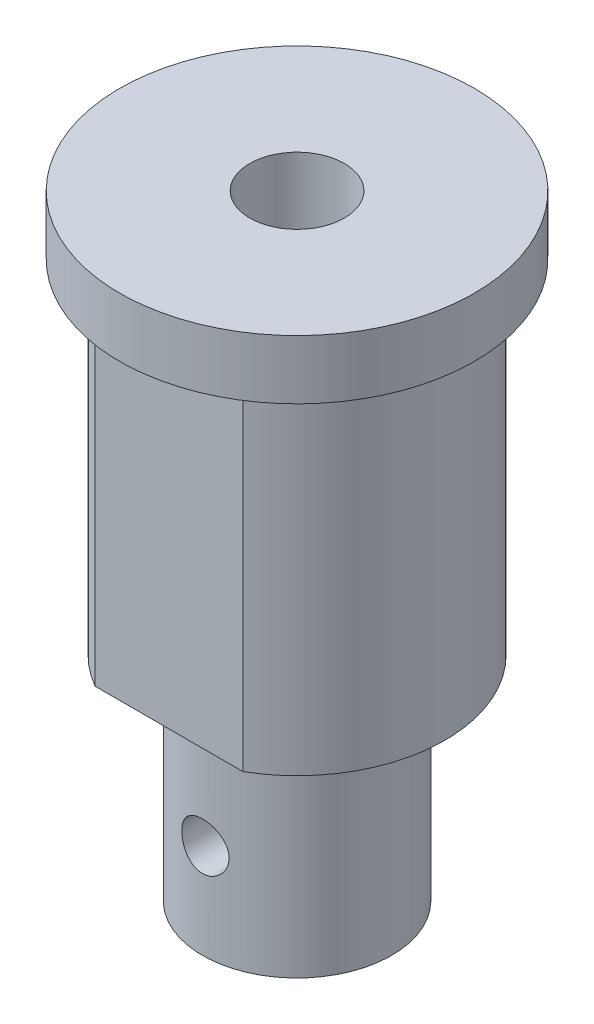
ISO-10303-21;
HEADER;
FILE_DESCRIPTION(('STEP AP214'),'2;1');
FILE_NAME('part.step','',(''),(''),'','','');
FILE_SCHEMA(('AUTOMOTIVE_DESIGN { 1 0 10303 214 1 1 1 1 }'));
ENDSEC;
DATA;
#1=APPLICATION_CONTEXT('core data for automotive mechanical design processes');
#2=APPLICATION_PROTOCOL_DEFINITION('international standard','automotive_design',2000,#1);
#3=PRODUCT_CONTEXT('',#1,'mechanical');
#4=PRODUCT('Part','Part','',(#3));
#5=PRODUCT_RELATED_PRODUCT_CATEGORY('part','',(#4));
#6=PRODUCT_DEFINITION_FORMATION('','',#4);
#7=PRODUCT_DEFINITION_CONTEXT('part definition',#1,'design');
#8=PRODUCT_DEFINITION('design','',#6,#7);
#9=PRODUCT_DEFINITION_SHAPE('','',#8);
#10=(LENGTH_UNIT() NAMED_UNIT(*) SI_UNIT(.MILLI.,.METRE.));
#11=(NAMED_UNIT(*) PLANE_ANGLE_UNIT() SI_UNIT($,.RADIAN.));
#12=(NAMED_UNIT(*) SI_UNIT($,.STERADIAN.) SOLID_ANGLE_UNIT());
#13=UNCERTAINTY_MEASURE_WITH_UNIT(LENGTH_MEASURE(1.E-05),#10,'distance_accuracy_value','');
#14=(GEOMETRIC_REPRESENTATION_CONTEXT(3) GLOBAL_UNCERTAINTY_ASSIGNED_CONTEXT((#13)) GLOBAL_UNIT_ASSIGNED_CONTEXT((#10,
#11,#12)) REPRESENTATION_CONTEXT('',''));
#15=CARTESIAN_POINT('',(0.,0.,0.));
#16=DIRECTION('',(0.,0.,1.));
#17=DIRECTION('',(1.,0.,0.));
#18=AXIS2_PLACEMENT_3D('',#15,#16,#17);
#19=CARTESIAN_POINT('',(0.,0.,0.));
#20=DIRECTION('',(0.,-1.,0.));
#21=DIRECTION('',(0.,0.,-1.));
#22=AXIS2_PLACEMENT_3D('',#19,#20,#21);
#23=CYLINDRICAL_SURFACE('',#22,4.);
#24=CARTESIAN_POINT('',(-2.,10.,3.46410161513775));
#25=CARTESIAN_POINT('',(-1.99999158748781,10.1042132054743,3.46411185715888));
#26=CARTESIAN_POINT('',(-1.99179963610437,10.2085621765338,3.46887633544978));
#27=CARTESIAN_POINT('',(-1.95944672580053,10.4140551772306,3.48724701669072));
#28=CARTESIAN_POINT('',(-1.93525221095662,10.5151920032478,3.50087179788183));
#29=CARTESIAN_POINT('',(-1.8721998159803,10.7109031564469,3.53498701490001));
#30=CARTESIAN_POINT('',(-1.83341988295963,10.8055092588493,3.55544089069169));
#31=CARTESIAN_POINT('',(-1.74253507245138,10.9868484504762,3.60085327291133));
#32=CARTESIAN_POINT('',(-1.69042947410139,11.0735811134368,3.62581202301253));
#33=CARTESIAN_POINT('',(-1.569333074538,11.2446114431334,3.67993738819289));
#34=CARTESIAN_POINT('',(-1.49930407053533,11.3281182675918,3.70928127465103));
#35=CARTESIAN_POINT('',(-1.34650761698202,11.4828167805706,3.76743965382121));
#36=CARTESIAN_POINT('',(-1.26373385204841,11.554002326204,3.79625387610258));
#37=CARTESIAN_POINT('',(-1.08097912631265,11.6867343011885,3.85242953961661));
#38=CARTESIAN_POINT('',(-0.980214377887152,11.7473075354233,3.87956212851245));
#39=CARTESIAN_POINT('',(-0.768314053336917,11.8502817067871,3.92701512184167));
#40=CARTESIAN_POINT('',(-0.657185076311986,11.8926941123508,3.94733982363631));
#41=CARTESIAN_POINT('',(-0.436089887818818,11.9550093225312,3.97760922492053));
#42=CARTESIAN_POINT('',(-0.326603580968786,11.9762990526921,3.98818960442739));
#43=CARTESIAN_POINT('',(-0.105141257404541,12.000332237369,4.00015167691179));
#44=CARTESIAN_POINT('',(0.00683321168520633,12.0030869135963,4.00153893568935));
#45=CARTESIAN_POINT('',(0.219665048849571,11.9905066520549,3.99525963833124));
#46=CARTESIAN_POINT('',(0.320642398354137,11.9767239689564,3.98836991784381));
#47=CARTESIAN_POINT('',(0.518627543836087,11.9342383121919,3.96748490519435));
#48=CARTESIAN_POINT('',(0.6156350421877,11.9055342220479,3.95348908132771));
#49=CARTESIAN_POINT('',(0.804618783139258,11.83383486782,3.91943166575325));
#50=CARTESIAN_POINT('',(0.896506847030396,11.7906473736558,3.89928883058403));
#51=CARTESIAN_POINT('',(1.07195360302661,11.6914731675971,3.8547529197337));
#52=CARTESIAN_POINT('',(1.15550929767728,11.6354818733953,3.83035832314967));
#53=CARTESIAN_POINT('',(1.3203473217964,11.5062092969339,3.7768878879846));
#54=CARTESIAN_POINT('',(1.40066815005872,11.431793943348,3.74758751996351));
#55=CARTESIAN_POINT('',(1.54820874059556,11.2708205501397,3.68908681173623));
#56=CARTESIAN_POINT('',(1.61541842314846,11.1842532554519,3.65988656531258));
#57=CARTESIAN_POINT('',(1.73901066928442,10.9947036151518,3.60288312184969));
#58=CARTESIAN_POINT('',(1.7944346299561,10.8910279538916,3.57528639981415));
#59=CARTESIAN_POINT('',(1.88663822600246,10.674124657282,3.52750900557152));
#60=CARTESIAN_POINT('',(1.92343731642178,10.5609071339649,3.50732060092135));
#61=CARTESIAN_POINT('',(1.97436042205008,10.3375709774344,3.47889271634069));
#62=CARTESIAN_POINT('',(1.99005024423995,10.2279177619129,3.46983311696993));
#63=CARTESIAN_POINT('',(2.00303389322285,10.0071973169669,3.46235838723219));
#64=CARTESIAN_POINT('',(2.00034071463005,9.8961311417604,3.46393573778623));
#65=CARTESIAN_POINT('',(1.97807208668793,9.68869216284256,3.4766867308117));
#66=CARTESIAN_POINT('',(1.96037563342492,9.59204109778422,3.48679175013308));
#67=CARTESIAN_POINT('',(1.91139256926489,9.40326442745802,3.51388043102682));
#68=CARTESIAN_POINT('',(1.88010155724727,9.31114029850652,3.53086632010068));
#69=CARTESIAN_POINT('',(1.80329517720973,9.12917733819489,3.57072444159313));
#70=CARTESIAN_POINT('',(1.7571881273853,9.03964196629395,3.59383286486126));
#71=CARTESIAN_POINT('',(1.65257412803176,8.86906145692096,3.643122389945));
#72=CARTESIAN_POINT('',(1.59406080866499,8.78802071296949,3.66930506710298));
#73=CARTESIAN_POINT('',(1.45767433439709,8.62604246495734,3.72575996912669));
#74=CARTESIAN_POINT('',(1.37829054462748,8.54640569858222,3.75613166308566));
#75=CARTESIAN_POINT('',(1.20680899079904,8.40117552399527,3.81468469955797));
#76=CARTESIAN_POINT('',(1.11470694931991,8.33558685947316,3.84286530015463));
#77=CARTESIAN_POINT('',(0.91707072510806,8.21885254816729,3.89482723381867));
#78=CARTESIAN_POINT('',(0.811246195112496,8.16813376383323,3.91847283343884));
#79=CARTESIAN_POINT('',(0.591044729317866,8.08572419203039,3.95766709918776));
#80=CARTESIAN_POINT('',(0.476675402917654,8.0540166963159,3.97322287353397));
#81=CARTESIAN_POINT('',(0.253959364539765,8.01326287251486,3.99335016363174));
#82=CARTESIAN_POINT('',(0.146022887268302,8.00240425133572,3.9987985581427));
#83=CARTESIAN_POINT('',(-0.0702519714699439,7.99831346600433,4.00084260752374));
#84=CARTESIAN_POINT('',(-0.178590198981612,8.00507513147113,3.99744136141634));
#85=CARTESIAN_POINT('',(-0.385075986136858,8.0348328243164,3.98267937668509));
#86=CARTESIAN_POINT('',(-0.483424641057418,8.05672973730905,3.97185789309443));
#87=CARTESIAN_POINT('',(-0.674891898931564,8.11465395980667,3.94384187353387));
#88=CARTESIAN_POINT('',(-0.768009749669771,8.15068329570691,3.92664642364424));
#89=CARTESIAN_POINT('',(-0.95084683359674,8.2374542549914,3.8865186139318));
#90=CARTESIAN_POINT('',(-1.0402503657229,8.28875921975186,3.86337234005404));
#91=CARTESIAN_POINT('',(-1.20954920326828,8.40391528811809,3.81376266676027));
#92=CARTESIAN_POINT('',(-1.28944011444319,8.46777215410157,3.78729774583428));
#93=CARTESIAN_POINT('',(-1.44582833859495,8.61359663555941,3.73057218840582));
#94=CARTESIAN_POINT('',(-1.52119665879199,8.69673418080028,3.70019591726075));
#95=CARTESIAN_POINT('',(-1.65732528394006,8.87489222830609,3.64126158628571));
#96=CARTESIAN_POINT('',(-1.71807266521244,8.96992313136051,3.61270515130784));
#97=CARTESIAN_POINT('',(-1.82486714716811,9.17330889413024,3.55999186256751));
#98=CARTESIAN_POINT('',(-1.87038902381914,9.28198991073527,3.53600256268535));
#99=CARTESIAN_POINT('',(-1.92395929504801,9.45057811963094,3.5069621813237));
#100=CARTESIAN_POINT('',(-1.93935666147967,9.50764782059067,3.49844389329401));
#101=CARTESIAN_POINT('',(-1.96508069805043,9.62323255750019,3.48406059323535));
#102=CARTESIAN_POINT('',(-1.97541091343282,9.68174655275425,3.47819372636051));
#103=CARTESIAN_POINT('',(-1.9887293296122,9.78360078924729,3.47059023668758));
#104=CARTESIAN_POINT('',(-1.99295091983786,9.82673305725007,3.46816389731815));
#105=CARTESIAN_POINT('',(-1.99858810035606,9.9132356930929,3.46491740045177));
#106=CARTESIAN_POINT('',(-2.00000350293331,9.9566060766667,3.46409735040492));
#107=CARTESIAN_POINT('',(-2.,10.,3.46410161513775));
#108=B_SPLINE_CURVE_WITH_KNOTS('',3,(#24,#25,#26,#27,#28,#29,#30,#31,#32,#33,#34,#35,#36,#37,
#38,#39,#40,#41,#42,#43,#44,#45,#46,#47,#48,#49,#50,#51,#52,#53,#54,#55,#56,#57,#58,#59,#60,#61,
#62,#63,#64,#65,#66,#67,#68,#69,#70,#71,#72,#73,#74,#75,#76,#77,#78,#79,#80,#81,#82,#83,#84,#85,
#86,#87,#88,#89,#90,#91,#92,#93,#94,#95,#96,#97,#98,#99,#100,#101,#102,#103,#104,#105,#106,
#107),.UNSPECIFIED.,.T.,.F.,(4,2,2,2,2,2,2,2,2,2,2,2,2,2,2,2,2,2,2,2,2,2,2,2,2,2,2,2,2,2,2,2,2,
2,2,2,2,2,2,2,2,4),(0.,0.312464245189432,0.62558578564961,0.937057191861536,1.24854545093096,
1.58572462503714,1.92307142172809,2.28315784481594,2.64301653931849,2.97726969939937,
3.31132047376147,3.61632194973143,3.92134625038977,4.2305906946636,4.5399459870461,
4.87854382917848,5.21740096495904,5.57777683462963,5.93777548427476,6.2692458171249,
6.60048186380813,6.89548366852117,7.19058104876193,7.49934592816242,7.80826972444161,
8.15613487165293,8.50411729960471,8.86128362829998,9.2181355962161,9.5422454078304,
9.8662417359201,10.1688884974705,10.4715786702809,10.7872150144301,11.102996602055,
11.450204837042,11.7977188569438,12.1562149808128,12.3351395323571,12.5139387197526,
12.6440387634036,12.7741475095882),.UNSPECIFIED.);
#109=CARTESIAN_POINT('',(-2.,10.,3.46410161513775));
#110=VERTEX_POINT('',#109);
#111=EDGE_CURVE('E77',#110,#110,#108,.T.);
#112=ORIENTED_EDGE('',*,*,#111,.F.);
#113=EDGE_LOOP('',(#112));
#114=FACE_BOUND('',#113,.T.);
#115=CARTESIAN_POINT('',(0.,54.,0.));
#116=DIRECTION('',(0.,-1.,0.));
#117=DIRECTION('',(0.,0.,-1.));
#118=AXIS2_PLACEMENT_3D('',#115,#116,#117);
#119=CIRCLE('',#118,4.);
#120=CARTESIAN_POINT('',(0.,54.,-4.));
#121=VERTEX_POINT('',#120);
#122=EDGE_CURVE('E11',#121,#121,#119,.T.);
#123=ORIENTED_EDGE('',*,*,#122,.F.);
#124=EDGE_LOOP('',(#123));
#125=FACE_BOUND('',#124,.T.);
#126=CARTESIAN_POINT('',(0.,2.,0.));
#127=DIRECTION('',(0.,-1.,0.));
#128=DIRECTION('',(0.,0.,-1.));
#129=AXIS2_PLACEMENT_3D('',#126,#127,#128);
#130=CIRCLE('',#129,4.);
#131=CARTESIAN_POINT('',(0.,2.,-4.));
#132=VERTEX_POINT('',#131);
#133=EDGE_CURVE('E126',#132,#132,#130,.T.);
#134=ORIENTED_EDGE('',*,*,#133,.T.);
#135=EDGE_LOOP('',(#134));
#136=FACE_BOUND('',#135,.T.);
#137=ADVANCED_FACE('F47',(#114,#125,#136),#23,.F.);
#138=CARTESIAN_POINT('',(0.,0.,0.));
#139=DIRECTION('',(0.,-1.,0.));
#140=DIRECTION('',(0.,0.,-1.));
#141=AXIS2_PLACEMENT_3D('',#138,#139,#140);
#142=CYLINDRICAL_SURFACE('',#141,8.);
#143=CARTESIAN_POINT('',(-2.,10.,7.74596669241484));
#144=CARTESIAN_POINT('',(-1.99999686287446,9.88955939925874,7.74596880070288));
#145=CARTESIAN_POINT('',(-1.99082099639812,9.77908408105718,7.74835444811678));
#146=CARTESIAN_POINT('',(-1.95441850037103,9.56130593746119,7.75761489594052));
#147=CARTESIAN_POINT('',(-1.92718136539368,9.45400499642545,7.76449230897304));
#148=CARTESIAN_POINT('',(-1.85559295970563,9.24575716945025,7.7819097967692));
#149=CARTESIAN_POINT('',(-1.81126378228359,9.14480227569143,7.79244514152366));
#150=CARTESIAN_POINT('',(-1.70681691300911,8.95175131796809,7.81598553623007));
#151=CARTESIAN_POINT('',(-1.64669855084855,8.85965563033583,7.82899069102792));
#152=CARTESIAN_POINT('',(-1.51096674184951,8.68491068379023,7.856325730845));
#153=CARTESIAN_POINT('',(-1.43506951016324,8.60248511971996,7.87067678098428));
#154=CARTESIAN_POINT('',(-1.27054565128053,8.45139088451173,7.89890300412235));
#155=CARTESIAN_POINT('',(-1.18191783534425,8.3827234995026,7.91277813253111));
#156=CARTESIAN_POINT('',(-0.992916160863165,8.26017962589498,7.93872332416466));
#157=CARTESIAN_POINT('',(-0.892395660956097,8.20652288947083,7.95076549920474));
#158=CARTESIAN_POINT('',(-0.683410547434211,8.11695228467753,7.97144649540787));
#159=CARTESIAN_POINT('',(-0.574947108633553,8.08103579846759,7.98008581867476));
#160=CARTESIAN_POINT('',(-0.35548700700333,8.02868173233713,7.99283807078545));
#161=CARTESIAN_POINT('',(-0.244586175639181,8.01186428453873,7.99703915075452));
#162=CARTESIAN_POINT('',(-0.0214630554102161,7.99699329657956,8.00074875285839));
#163=CARTESIAN_POINT('',(0.0907590356304544,7.99893698223232,8.00025796877364));
#164=CARTESIAN_POINT('',(0.310704494344774,8.02125988020012,7.99470475962828));
#165=CARTESIAN_POINT('',(0.418472431202134,8.04122906004308,7.989744018727));
#166=CARTESIAN_POINT('',(0.629076494827372,8.0983770160388,7.97592669219884));
#167=CARTESIAN_POINT('',(0.731912358740876,8.13555670830193,7.96706989918753));
#168=CARTESIAN_POINT('',(0.930813407003613,8.22640205654965,7.94630007760717));
#169=CARTESIAN_POINT('',(1.02680901953301,8.2802136357294,7.93436015756043));
#170=CARTESIAN_POINT('',(1.20855124468098,8.40268454329301,7.9087192304772));
#171=CARTESIAN_POINT('',(1.29429607017101,8.4713464548485,7.89501791721992));
#172=CARTESIAN_POINT('',(1.45554807016991,8.6237669935859,7.86690971015617));
#173=CARTESIAN_POINT('',(1.5307153581504,8.70788391387822,7.85249375620735));
#174=CARTESIAN_POINT('',(1.66595275192604,8.8876799788322,7.82492034813365));
#175=CARTESIAN_POINT('',(1.72602215209203,8.9833596635928,7.81176295284777));
#176=CARTESIAN_POINT('',(1.8295762580452,9.18423202731917,7.78816397465319));
#177=CARTESIAN_POINT('',(1.87297913394098,9.28946858425056,7.77773586980577));
#178=CARTESIAN_POINT('',(1.94137124127268,9.50606837446116,7.76094912111966));
#179=CARTESIAN_POINT('',(1.96636441310582,9.61743029118651,7.75458960648175));
#180=CARTESIAN_POINT('',(1.99666371093214,9.8399676012185,7.74684284831313));
#181=CARTESIAN_POINT('',(2.0024723791357,9.9510702346637,7.74532871274919));
#182=CARTESIAN_POINT('',(1.99561359241244,10.1726575492625,7.74709874784832));
#183=CARTESIAN_POINT('',(1.98294783827904,10.283142286361,7.75038247681013));
#184=CARTESIAN_POINT('',(1.93994037115013,10.4984914119638,7.76125665563649));
#185=CARTESIAN_POINT('',(1.9098912546254,10.6034181812567,7.76877576187501));
#186=CARTESIAN_POINT('',(1.8332944653365,10.8067451662813,7.7872057461677));
#187=CARTESIAN_POINT('',(1.78674483817004,10.9051446072443,7.79811702598891));
#188=CARTESIAN_POINT('',(1.67741653434925,11.0947530222939,7.8223690967461));
#189=CARTESIAN_POINT('',(1.6143374030685,11.1857830720345,7.83575334885314));
#190=CARTESIAN_POINT('',(1.47412058586891,11.3561506902411,7.86333666457373));
#191=CARTESIAN_POINT('',(1.39698058961088,11.4354863333201,7.87753586182777));
#192=CARTESIAN_POINT('',(1.22852544196945,11.5822488340568,7.90557922425285));
#193=CARTESIAN_POINT('',(1.13690390506319,11.649328050039,7.91940561649469));
#194=CARTESIAN_POINT('',(0.943405365389351,11.767148693561,7.94477773290988));
#195=CARTESIAN_POINT('',(0.841528897915182,11.8178909732866,7.95632357603169));
#196=CARTESIAN_POINT('',(0.631116403462181,11.9011568276223,7.97576092590651));
#197=CARTESIAN_POINT('',(0.522634762055764,11.9338114275033,7.98367864017925));
#198=CARTESIAN_POINT('',(0.301499520637613,11.9803682676867,7.99508234716634));
#199=CARTESIAN_POINT('',(0.188846730082481,11.9942741269912,7.99856919514738));
#200=CARTESIAN_POINT('',(-0.0341670528866464,12.0027351791511,8.00068338817612));
#201=CARTESIAN_POINT('',(-0.144507653932043,11.9978034181908,7.99943957759977));
#202=CARTESIAN_POINT('',(-0.362734992829501,11.9699043454113,7.99251792914887));
#203=CARTESIAN_POINT('',(-0.470621803561857,11.9469375699737,7.98684022314338));
#204=CARTESIAN_POINT('',(-0.680342071289549,11.8838955604583,7.97170865707779));
#205=CARTESIAN_POINT('',(-0.782204989161727,11.8439130933712,7.96227529004785));
#206=CARTESIAN_POINT('',(-0.977834106083249,11.7480588419609,7.94062577827316));
#207=CARTESIAN_POINT('',(-1.07159928253127,11.692185054659,7.92840928277515));
#208=CARTESIAN_POINT('',(-1.25080385684661,11.5645695320077,7.90214499360575));
#209=CARTESIAN_POINT('',(-1.33598997659667,11.4924797141923,7.8880603388333));
#210=CARTESIAN_POINT('',(-1.49323004054701,11.3351542960453,7.8598129811438));
#211=CARTESIAN_POINT('',(-1.56528065015318,11.2499153677777,7.84565025934605));
#212=CARTESIAN_POINT('',(-1.69552405294366,11.0667971716211,7.81854951691005));
#213=CARTESIAN_POINT('',(-1.75343323883276,10.9687117532695,7.80563927346578));
#214=CARTESIAN_POINT('',(-1.85185379317094,10.7638890202504,7.78287910989656));
#215=CARTESIAN_POINT('',(-1.8923778195043,10.6571580678123,7.77302696466428));
#216=CARTESIAN_POINT('',(-1.94884505714201,10.4588459763297,7.75903817501475));
#217=CARTESIAN_POINT('',(-1.96798634119376,10.3682136712277,7.75417326006998));
#218=CARTESIAN_POINT('',(-1.99356458514354,10.1850622620046,7.74763677165241));
#219=CARTESIAN_POINT('',(-2.0000026287435,10.0925433195112,7.74596492578216));
#220=CARTESIAN_POINT('',(-2.,10.,7.74596669241484));
#221=B_SPLINE_CURVE_WITH_KNOTS('',3,(#143,#144,#145,#146,#147,#148,#149,#150,#151,#152,#153,
#154,#155,#156,#157,#158,#159,#160,#161,#162,#163,#164,#165,#166,#167,#168,#169,#170,#171,#172,
#173,#174,#175,#176,#177,#178,#179,#180,#181,#182,#183,#184,#185,#186,#187,#188,#189,#190,#191,
#192,#193,#194,#195,#196,#197,#198,#199,#200,#201,#202,#203,#204,#205,#206,#207,#208,#209,#210,
#211,#212,#213,#214,#215,#216,#217,#218,#219,#220),.UNSPECIFIED.,.T.,.F.,(4,2,2,2,2,2,2,2,2,2,2,
2,2,2,2,2,2,2,2,2,2,2,2,2,2,2,2,2,2,2,2,2,2,2,2,2,2,2,4),(0.,0.33098195338891,0.662156593142932,
0.992904581732817,1.32366661404383,1.66099163354381,1.99834817183893,2.34041197118336,
2.68242527877674,3.01751000796277,3.35254518932816,3.68014610151158,4.00776445379829,
4.33834299403556,4.66897908375131,5.00856373257529,5.34816424959842,5.68941145606722,
6.03058560103638,6.36274859809374,6.69488101747042,7.02157924007366,7.34831617137134,
7.68146276687326,8.01466415108036,8.35620264772255,8.69772332575643,9.03673658245543,
9.37568439127231,9.70546756901965,10.0352409390158,10.3632390124777,10.6912784459046,
11.0271767726566,11.3631602525241,11.7054118182895,12.0474137709606,12.3247826174462,
12.6021278008238),.UNSPECIFIED.);
#222=CARTESIAN_POINT('',(-2.,10.,7.74596669241484));
#223=VERTEX_POINT('',#222);
#224=EDGE_CURVE('E128',#223,#223,#221,.T.);
#225=ORIENTED_EDGE('',*,*,#224,.F.);
#226=EDGE_LOOP('',(#225));
#227=FACE_BOUND('',#226,.T.);
#228=CARTESIAN_POINT('',(0.,20.,0.));
#229=DIRECTION('',(0.,-1.,0.));
#230=DIRECTION('',(0.,0.,-1.));
#231=AXIS2_PLACEMENT_3D('',#228,#229,#230);
#232=CIRCLE('',#231,8.);
#233=CARTESIAN_POINT('',(0.,20.,-8.));
#234=VERTEX_POINT('',#233);
#235=EDGE_CURVE('E88',#234,#234,#232,.T.);
#236=ORIENTED_EDGE('',*,*,#235,.T.);
#237=EDGE_LOOP('',(#236));
#238=FACE_BOUND('',#237,.T.);
#239=CARTESIAN_POINT('',(0.,2.,0.));
#240=DIRECTION('',(0.,-1.,0.));
#241=DIRECTION('',(0.,0.,-1.));
#242=AXIS2_PLACEMENT_3D('',#239,#240,#241);
#243=CIRCLE('',#242,8.);
#244=CARTESIAN_POINT('',(0.,2.,-8.));
#245=VERTEX_POINT('',#244);
#246=EDGE_CURVE('E129',#245,#245,#243,.T.);
#247=ORIENTED_EDGE('',*,*,#246,.F.);
#248=EDGE_LOOP('',(#247));
#249=FACE_BOUND('',#248,.T.);
#250=ADVANCED_FACE('F105',(#227,#238,#249),#142,.T.);
#251=CARTESIAN_POINT('',(4.,54.,0.));
#252=DIRECTION('',(0.,1.,0.));
#253=DIRECTION('',(0.,0.,1.));
#254=AXIS2_PLACEMENT_3D('',#251,#252,#253);
#255=PLANE('',#254);
#256=ORIENTED_EDGE('',*,*,#122,.T.);
#257=EDGE_LOOP('',(#256));
#258=FACE_BOUND('',#257,.T.);
#259=CARTESIAN_POINT('',(0.,54.,0.));
#260=DIRECTION('',(0.,-1.,0.));
#261=DIRECTION('',(0.,0.,-1.));
#262=AXIS2_PLACEMENT_3D('',#259,#260,#261);
#263=CIRCLE('',#262,15.);
#264=CARTESIAN_POINT('',(0.,54.,-15.));
#265=VERTEX_POINT('',#264);
#266=EDGE_CURVE('E54',#265,#265,#263,.T.);
#267=ORIENTED_EDGE('',*,*,#266,.F.);
#268=EDGE_LOOP('',(#267));
#269=FACE_BOUND('',#268,.T.);
#270=ADVANCED_FACE('F103',(#258,#269),#255,.T.);
#271=CARTESIAN_POINT('',(0.,0.,0.));
#272=DIRECTION('',(0.,-1.,0.));
#273=DIRECTION('',(0.,0.,-1.));
#274=AXIS2_PLACEMENT_3D('',#271,#272,#273);
#275=CYLINDRICAL_SURFACE('',#274,15.);
#276=ORIENTED_EDGE('',*,*,#266,.T.);
#277=EDGE_LOOP('',(#276));
#278=FACE_BOUND('',#277,.T.);
#279=CARTESIAN_POINT('',(0.,49.,0.));
#280=DIRECTION('',(0.,-1.,0.));
#281=DIRECTION('',(0.,0.,-1.));
#282=AXIS2_PLACEMENT_3D('',#279,#280,#281);
#283=CIRCLE('',#282,15.);
#284=CARTESIAN_POINT('',(0.,49.,-15.));
#285=VERTEX_POINT('',#284);
#286=EDGE_CURVE('E90',#285,#285,#283,.T.);
#287=ORIENTED_EDGE('',*,*,#286,.F.);
#288=EDGE_LOOP('',(#287));
#289=FACE_BOUND('',#288,.T.);
#290=ADVANCED_FACE('F100',(#278,#289),#275,.T.);
#291=CARTESIAN_POINT('',(15.,49.,0.));
#292=DIRECTION('',(0.,-1.,0.));
#293=DIRECTION('',(0.,0.,-1.));
#294=AXIS2_PLACEMENT_3D('',#291,#292,#293);
#295=PLANE('',#294);
#296=CARTESIAN_POINT('',(0.,49.,0.));
#297=DIRECTION('',(0.,-1.,0.));
#298=DIRECTION('',(0.,0.,-1.));
#299=AXIS2_PLACEMENT_3D('',#296,#297,#298);
#300=CIRCLE('',#299,12.5);
#301=CARTESIAN_POINT('',(-6.24999999999998,49.,10.8253175473055));
#302=VERTEX_POINT('',#301);
#303=CARTESIAN_POINT('',(6.24999999999998,49.,10.8253175473055));
#304=VERTEX_POINT('',#303);
#305=EDGE_CURVE('E84',#302,#304,#300,.T.);
#306=ORIENTED_EDGE('',*,*,#305,.F.);
#307=DIRECTION('',(-1.,0.,0.));
#308=VECTOR('',#307,1.);
#309=CARTESIAN_POINT('',(-6.24999999999998,49.,10.8253175473055));
#310=LINE('',#309,#308);
#311=EDGE_CURVE('E66',#304,#302,#310,.T.);
#312=ORIENTED_EDGE('',*,*,#311,.F.);
#313=EDGE_LOOP('',(#306,#312));
#314=FACE_BOUND('',#313,.T.);
#315=ORIENTED_EDGE('',*,*,#286,.T.);
#316=EDGE_LOOP('',(#315));
#317=FACE_BOUND('',#316,.T.);
#318=ADVANCED_FACE('F111',(#314,#317),#295,.T.);
#319=CARTESIAN_POINT('',(0.,0.,0.));
#320=DIRECTION('',(0.,-1.,0.));
#321=DIRECTION('',(0.,0.,-1.));
#322=AXIS2_PLACEMENT_3D('',#319,#320,#321);
#323=CYLINDRICAL_SURFACE('',#322,12.5);
#324=DIRECTION('',(0.,-1.,0.));
#325=VECTOR('',#324,1.);
#326=CARTESIAN_POINT('',(6.24999999999998,61.6589889011721,10.8253175473055));
#327=LINE('',#326,#325);
#328=CARTESIAN_POINT('',(6.24999999999998,20.,10.8253175473055));
#329=VERTEX_POINT('',#328);
#330=EDGE_CURVE('E73',#304,#329,#327,.T.);
#331=ORIENTED_EDGE('',*,*,#330,.T.);
#332=CARTESIAN_POINT('',(0.,20.,0.));
#333=DIRECTION('',(0.,-1.,0.));
#334=DIRECTION('',(0.,0.,-1.));
#335=AXIS2_PLACEMENT_3D('',#332,#333,#334);
#336=CIRCLE('',#335,12.5);
#337=CARTESIAN_POINT('',(-6.24999999999998,20.,10.8253175473055));
#338=VERTEX_POINT('',#337);
#339=EDGE_CURVE('E82',#338,#329,#336,.T.);
#340=ORIENTED_EDGE('',*,*,#339,.F.);
#341=DIRECTION('',(0.,-1.,0.));
#342=VECTOR('',#341,1.);
#343=CARTESIAN_POINT('',(-6.24999999999998,61.6589889011721,10.8253175473055));
#344=LINE('',#343,#342);
#345=EDGE_CURVE('E61',#302,#338,#344,.T.);
#346=ORIENTED_EDGE('',*,*,#345,.F.);
#347=ORIENTED_EDGE('',*,*,#305,.T.);
#348=EDGE_LOOP('',(#331,#340,#346,#347));
#349=FACE_BOUND('',#348,.T.);
#350=ADVANCED_FACE('F81',(#349),#323,.T.);
#351=CARTESIAN_POINT('',(12.5,20.,0.));
#352=DIRECTION('',(0.,-1.,0.));
#353=DIRECTION('',(0.,0.,-1.));
#354=AXIS2_PLACEMENT_3D('',#351,#352,#353);
#355=PLANE('',#354);
#356=DIRECTION('',(1.,0.,0.));
#357=VECTOR('',#356,1.);
#358=CARTESIAN_POINT('',(-6.24999999999998,20.,10.8253175473055));
#359=LINE('',#358,#357);
#360=EDGE_CURVE('E70',#338,#329,#359,.T.);
#361=ORIENTED_EDGE('',*,*,#360,.F.);
#362=ORIENTED_EDGE('',*,*,#339,.T.);
#363=EDGE_LOOP('',(#361,#362));
#364=FACE_BOUND('',#363,.T.);
#365=ORIENTED_EDGE('',*,*,#235,.F.);
#366=EDGE_LOOP('',(#365));
#367=FACE_BOUND('',#366,.T.);
#368=ADVANCED_FACE('F86',(#364,#367),#355,.T.);
#369=CARTESIAN_POINT('',(-6.24999999999998,61.6589889011721,10.8253175473055));
#370=DIRECTION('',(0.,0.,-1.));
#371=DIRECTION('',(-1.,0.,0.));
#372=AXIS2_PLACEMENT_3D('',#369,#370,#371);
#373=PLANE('',#372);
#374=ORIENTED_EDGE('',*,*,#311,.T.);
#375=ORIENTED_EDGE('',*,*,#345,.T.);
#376=ORIENTED_EDGE('',*,*,#360,.T.);
#377=ORIENTED_EDGE('',*,*,#330,.F.);
#378=EDGE_LOOP('',(#374,#375,#376,#377));
#379=FACE_BOUND('',#378,.T.);
#380=ADVANCED_FACE('F72',(#379),#373,.F.);
#381=CARTESIAN_POINT('',(0.,10.,15.001));
#382=DIRECTION('',(0.,0.,-1.));
#383=DIRECTION('',(-1.,0.,0.));
#384=AXIS2_PLACEMENT_3D('',#381,#382,#383);
#385=CYLINDRICAL_SURFACE('',#384,2.);
#386=ORIENTED_EDGE('',*,*,#111,.T.);
#387=EDGE_LOOP('',(#386));
#388=FACE_BOUND('',#387,.T.);
#389=ORIENTED_EDGE('',*,*,#224,.T.);
#390=EDGE_LOOP('',(#389));
#391=FACE_BOUND('',#390,.T.);
#392=ADVANCED_FACE('F145',(#388,#391),#385,.F.);
#393=CARTESIAN_POINT('',(0.,2.,0.));
#394=DIRECTION('',(0.,-1.,0.));
#395=DIRECTION('',(0.,0.,-1.));
#396=AXIS2_PLACEMENT_3D('',#393,#394,#395);
#397=PLANE('',#396);
#398=ORIENTED_EDGE('',*,*,#133,.F.);
#399=EDGE_LOOP('',(#398));
#400=FACE_BOUND('',#399,.T.);
#401=ORIENTED_EDGE('',*,*,#246,.T.);
#402=EDGE_LOOP('',(#401));
#403=FACE_BOUND('',#402,.T.);
#404=ADVANCED_FACE('F150',(#400,#403),#397,.T.);
#405=CLOSED_SHELL('',(#137,#250,#270,#290,#318,#350,#368,#380,#392,#404));
#406=MANIFOLD_SOLID_BREP('B2',#405);
#407=ADVANCED_BREP_SHAPE_REPRESENTATION('',(#18,#406),#14);
#408=SHAPE_DEFINITION_REPRESENTATION(#9,#407);
ENDSEC;
END-ISO-10303-21;
